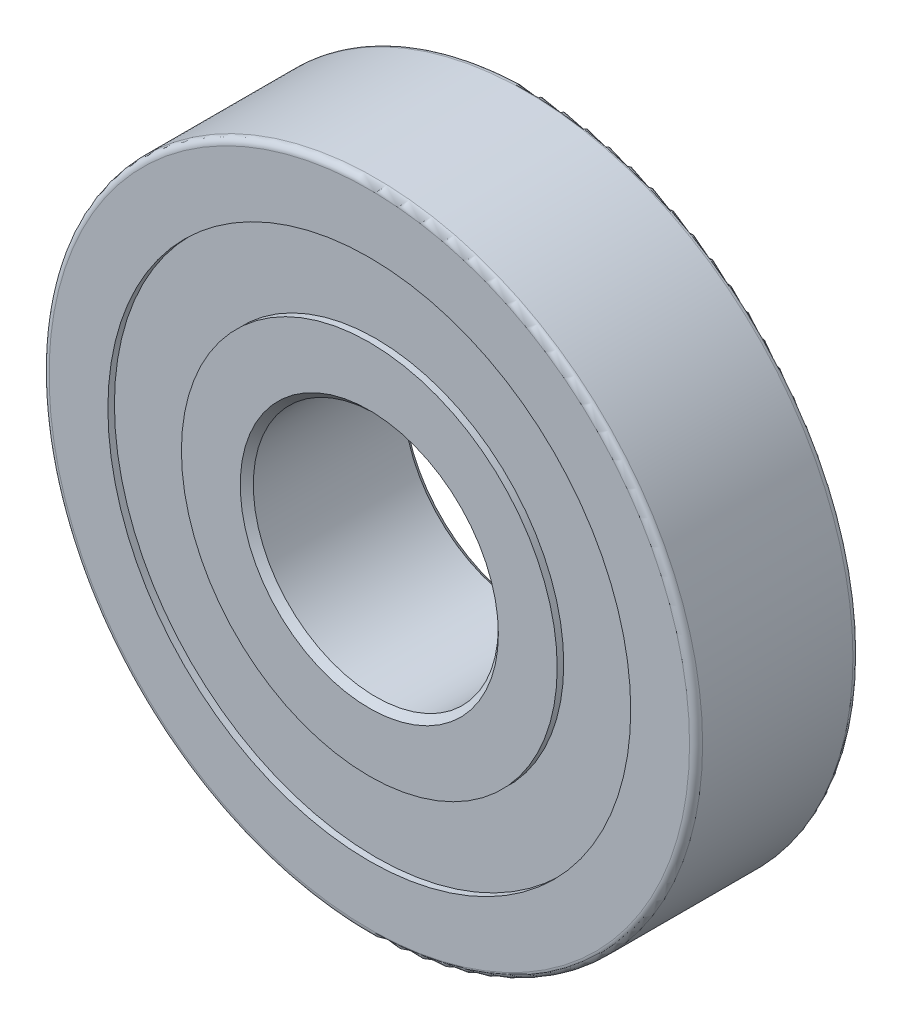
ISO-10303-21;
HEADER;
FILE_DESCRIPTION(('STEP AP214'),'2;1');
FILE_NAME('part.step','',(''),(''),'','','');
FILE_SCHEMA(('AUTOMOTIVE_DESIGN { 1 0 10303 214 1 1 1 1 }'));
ENDSEC;
DATA;
#1=APPLICATION_CONTEXT('core data for automotive mechanical design processes');
#2=APPLICATION_PROTOCOL_DEFINITION('international standard','automotive_design',2000,#1);
#3=PRODUCT_CONTEXT('',#1,'mechanical');
#4=PRODUCT('Part','Part','',(#3));
#5=PRODUCT_RELATED_PRODUCT_CATEGORY('part','',(#4));
#6=PRODUCT_DEFINITION_FORMATION('','',#4);
#7=PRODUCT_DEFINITION_CONTEXT('part definition',#1,'design');
#8=PRODUCT_DEFINITION('design','',#6,#7);
#9=PRODUCT_DEFINITION_SHAPE('','',#8);
#10=(LENGTH_UNIT() NAMED_UNIT(*) SI_UNIT(.MILLI.,.METRE.));
#11=(NAMED_UNIT(*) PLANE_ANGLE_UNIT() SI_UNIT($,.RADIAN.));
#12=(NAMED_UNIT(*) SI_UNIT($,.STERADIAN.) SOLID_ANGLE_UNIT());
#13=UNCERTAINTY_MEASURE_WITH_UNIT(LENGTH_MEASURE(1.E-05),#10,'distance_accuracy_value','');
#14=(GEOMETRIC_REPRESENTATION_CONTEXT(3) GLOBAL_UNCERTAINTY_ASSIGNED_CONTEXT((#13)) GLOBAL_UNIT_ASSIGNED_CONTEXT((#10,
#11,#12)) REPRESENTATION_CONTEXT('',''));
#15=CARTESIAN_POINT('',(0.,0.,0.));
#16=DIRECTION('',(0.,0.,1.));
#17=DIRECTION('',(1.,0.,0.));
#18=AXIS2_PLACEMENT_3D('',#15,#16,#17);
#19=CARTESIAN_POINT('',(0.,0.,1.5875));
#20=DIRECTION('',(0.,0.,-1.));
#21=DIRECTION('',(-1.,0.,0.));
#22=AXIS2_PLACEMENT_3D('',#19,#20,#21);
#23=CYLINDRICAL_SURFACE('',#22,5.08);
#24=CARTESIAN_POINT('',(0.,0.,-1.5875));
#25=DIRECTION('',(0.,0.,1.));
#26=DIRECTION('',(1.,0.,0.));
#27=AXIS2_PLACEMENT_3D('',#24,#25,#26);
#28=CIRCLE('',#27,5.08);
#29=CARTESIAN_POINT('',(5.08,0.,-1.5875));
#30=VERTEX_POINT('',#29);
#31=EDGE_CURVE('E81',#30,#30,#28,.T.);
#32=ORIENTED_EDGE('',*,*,#31,.F.);
#33=EDGE_LOOP('',(#32));
#34=FACE_BOUND('',#33,.T.);
#35=CARTESIAN_POINT('',(0.,0.,-1.4605));
#36=DIRECTION('',(0.,0.,1.));
#37=DIRECTION('',(1.,0.,0.));
#38=AXIS2_PLACEMENT_3D('',#35,#36,#37);
#39=CIRCLE('',#38,5.08);
#40=CARTESIAN_POINT('',(5.08,0.,-1.4605));
#41=VERTEX_POINT('',#40);
#42=EDGE_CURVE('E87',#41,#41,#39,.T.);
#43=ORIENTED_EDGE('',*,*,#42,.T.);
#44=EDGE_LOOP('',(#43));
#45=FACE_BOUND('',#44,.T.);
#46=ADVANCED_FACE('F44',(#34,#45),#23,.F.);
#47=CARTESIAN_POINT('',(0.,0.,1.4605));
#48=DIRECTION('',(0.,0.,1.));
#49=DIRECTION('',(1.,0.,0.));
#50=AXIS2_PLACEMENT_3D('',#47,#48,#49);
#51=CIRCLE('',#50,5.08);
#52=CARTESIAN_POINT('',(5.08,0.,1.4605));
#53=VERTEX_POINT('',#52);
#54=EDGE_CURVE('E77',#53,#53,#51,.T.);
#55=ORIENTED_EDGE('',*,*,#54,.F.);
#56=EDGE_LOOP('',(#55));
#57=FACE_BOUND('',#56,.T.);
#58=CARTESIAN_POINT('',(0.,0.,1.5875));
#59=DIRECTION('',(0.,0.,1.));
#60=DIRECTION('',(1.,0.,0.));
#61=AXIS2_PLACEMENT_3D('',#58,#59,#60);
#62=CIRCLE('',#61,5.08);
#63=CARTESIAN_POINT('',(5.08,0.,1.5875));
#64=VERTEX_POINT('',#63);
#65=EDGE_CURVE('E80',#64,#64,#62,.T.);
#66=ORIENTED_EDGE('',*,*,#65,.T.);
#67=EDGE_LOOP('',(#66));
#68=FACE_BOUND('',#67,.T.);
#69=ADVANCED_FACE('F122',(#57,#68),#23,.F.);
#70=CARTESIAN_POINT('',(0.,0.,1.5875));
#71=DIRECTION('',(0.,0.,-1.));
#72=DIRECTION('',(-1.,0.,0.));
#73=AXIS2_PLACEMENT_3D('',#70,#71,#72);
#74=CYLINDRICAL_SURFACE('',#73,6.35);
#75=CARTESIAN_POINT('',(0.,0.,-1.4605));
#76=DIRECTION('',(0.,0.,1.));
#77=DIRECTION('',(1.,0.,0.));
#78=AXIS2_PLACEMENT_3D('',#75,#76,#77);
#79=CIRCLE('',#78,6.35);
#80=CARTESIAN_POINT('',(6.35,0.,-1.4605));
#81=VERTEX_POINT('',#80);
#82=EDGE_CURVE('E71',#81,#81,#79,.T.);
#83=ORIENTED_EDGE('',*,*,#82,.T.);
#84=EDGE_LOOP('',(#83));
#85=FACE_BOUND('',#84,.T.);
#86=CARTESIAN_POINT('',(0.,0.,1.4605));
#87=DIRECTION('',(0.,0.,1.));
#88=DIRECTION('',(1.,0.,0.));
#89=AXIS2_PLACEMENT_3D('',#86,#87,#88);
#90=CIRCLE('',#89,6.35);
#91=CARTESIAN_POINT('',(6.35,0.,1.4605));
#92=VERTEX_POINT('',#91);
#93=EDGE_CURVE('E74',#92,#92,#90,.F.);
#94=ORIENTED_EDGE('',*,*,#93,.T.);
#95=EDGE_LOOP('',(#94));
#96=FACE_BOUND('',#95,.T.);
#97=ADVANCED_FACE('F128',(#85,#96),#74,.T.);
#98=CARTESIAN_POINT('',(0.,0.,1.5875));
#99=DIRECTION('',(0.,0.,1.));
#100=DIRECTION('',(1.,0.,0.));
#101=AXIS2_PLACEMENT_3D('',#98,#99,#100);
#102=PLANE('',#101);
#103=CARTESIAN_POINT('',(0.,0.,1.5875));
#104=DIRECTION('',(0.,0.,1.));
#105=DIRECTION('',(1.,0.,0.));
#106=AXIS2_PLACEMENT_3D('',#103,#104,#105);
#107=CIRCLE('',#106,6.223);
#108=CARTESIAN_POINT('',(6.223,0.,1.5875));
#109=VERTEX_POINT('',#108);
#110=EDGE_CURVE('E65',#109,#109,#107,.T.);
#111=ORIENTED_EDGE('',*,*,#110,.T.);
#112=EDGE_LOOP('',(#111));
#113=FACE_BOUND('',#112,.T.);
#114=ORIENTED_EDGE('',*,*,#65,.F.);
#115=EDGE_LOOP('',(#114));
#116=FACE_BOUND('',#115,.T.);
#117=ADVANCED_FACE('F174',(#113,#116),#102,.T.);
#118=CARTESIAN_POINT('',(0.,0.,-1.5875));
#119=DIRECTION('',(0.,0.,1.));
#120=DIRECTION('',(1.,0.,0.));
#121=AXIS2_PLACEMENT_3D('',#118,#119,#120);
#122=PLANE('',#121);
#123=CARTESIAN_POINT('',(0.,0.,-1.5875));
#124=DIRECTION('',(0.,0.,1.));
#125=DIRECTION('',(1.,0.,0.));
#126=AXIS2_PLACEMENT_3D('',#123,#124,#125);
#127=CIRCLE('',#126,6.223);
#128=CARTESIAN_POINT('',(6.223,0.,-1.5875));
#129=VERTEX_POINT('',#128);
#130=EDGE_CURVE('E68',#129,#129,#127,.F.);
#131=ORIENTED_EDGE('',*,*,#130,.T.);
#132=EDGE_LOOP('',(#131));
#133=FACE_BOUND('',#132,.T.);
#134=ORIENTED_EDGE('',*,*,#31,.T.);
#135=EDGE_LOOP('',(#134));
#136=FACE_BOUND('',#135,.T.);
#137=ADVANCED_FACE('F170',(#133,#136),#122,.F.);
#138=CARTESIAN_POINT('',(0.,0.,1.4605));
#139=DIRECTION('',(0.,0.,1.));
#140=DIRECTION('',(1.,0.,0.));
#141=AXIS2_PLACEMENT_3D('',#138,#139,#140);
#142=PLANE('',#141);
#143=CARTESIAN_POINT('',(0.,0.,1.4605));
#144=DIRECTION('',(0.,0.,1.));
#145=DIRECTION('',(1.,0.,0.));
#146=AXIS2_PLACEMENT_3D('',#143,#144,#145);
#147=CIRCLE('',#146,3.65125);
#148=CARTESIAN_POINT('',(3.65125,0.,1.4605));
#149=VERTEX_POINT('',#148);
#150=EDGE_CURVE('E84',#149,#149,#147,.T.);
#151=ORIENTED_EDGE('',*,*,#150,.F.);
#152=EDGE_LOOP('',(#151));
#153=FACE_BOUND('',#152,.T.);
#154=ORIENTED_EDGE('',*,*,#54,.T.);
#155=EDGE_LOOP('',(#154));
#156=FACE_BOUND('',#155,.T.);
#157=ADVANCED_FACE('F163',(#153,#156),#142,.T.);
#158=CARTESIAN_POINT('',(0.,0.,-1.4605));
#159=DIRECTION('',(0.,0.,1.));
#160=DIRECTION('',(1.,0.,0.));
#161=AXIS2_PLACEMENT_3D('',#158,#159,#160);
#162=PLANE('',#161);
#163=CARTESIAN_POINT('',(0.,0.,-1.4605));
#164=DIRECTION('',(0.,0.,1.));
#165=DIRECTION('',(1.,0.,0.));
#166=AXIS2_PLACEMENT_3D('',#163,#164,#165);
#167=CIRCLE('',#166,3.65125);
#168=CARTESIAN_POINT('',(3.65125,0.,-1.4605));
#169=VERTEX_POINT('',#168);
#170=EDGE_CURVE('E90',#169,#169,#167,.F.);
#171=ORIENTED_EDGE('',*,*,#170,.F.);
#172=EDGE_LOOP('',(#171));
#173=FACE_BOUND('',#172,.T.);
#174=ORIENTED_EDGE('',*,*,#42,.F.);
#175=EDGE_LOOP('',(#174));
#176=FACE_BOUND('',#175,.T.);
#177=ADVANCED_FACE('F119',(#173,#176),#162,.F.);
#178=CARTESIAN_POINT('',(0.,0.,1.5875));
#179=DIRECTION('',(0.,0.,-1.));
#180=DIRECTION('',(-1.,0.,0.));
#181=AXIS2_PLACEMENT_3D('',#178,#179,#180);
#182=CYLINDRICAL_SURFACE('',#181,3.65125);
#183=CARTESIAN_POINT('',(0.,0.,-1.5875));
#184=DIRECTION('',(0.,0.,1.));
#185=DIRECTION('',(1.,0.,0.));
#186=AXIS2_PLACEMENT_3D('',#183,#184,#185);
#187=CIRCLE('',#186,3.65125);
#188=CARTESIAN_POINT('',(3.65125,0.,-1.5875));
#189=VERTEX_POINT('',#188);
#190=EDGE_CURVE('E96',#189,#189,#187,.T.);
#191=ORIENTED_EDGE('',*,*,#190,.T.);
#192=EDGE_LOOP('',(#191));
#193=FACE_BOUND('',#192,.T.);
#194=ORIENTED_EDGE('',*,*,#170,.T.);
#195=EDGE_LOOP('',(#194));
#196=FACE_BOUND('',#195,.T.);
#197=ADVANCED_FACE('F109',(#193,#196),#182,.T.);
#198=CARTESIAN_POINT('',(0.,0.,1.5875));
#199=DIRECTION('',(0.,0.,-1.));
#200=DIRECTION('',(-1.,0.,0.));
#201=AXIS2_PLACEMENT_3D('',#198,#199,#200);
#202=CYLINDRICAL_SURFACE('',#201,2.38125);
#203=CARTESIAN_POINT('',(0.,0.,-1.4605));
#204=DIRECTION('',(0.,0.,1.));
#205=DIRECTION('',(1.,0.,0.));
#206=AXIS2_PLACEMENT_3D('',#203,#204,#205);
#207=CIRCLE('',#206,2.38125);
#208=CARTESIAN_POINT('',(2.38125,0.,-1.4605));
#209=VERTEX_POINT('',#208);
#210=EDGE_CURVE('E52',#209,#209,#207,.F.);
#211=ORIENTED_EDGE('',*,*,#210,.T.);
#212=EDGE_LOOP('',(#211));
#213=FACE_BOUND('',#212,.T.);
#214=CARTESIAN_POINT('',(0.,0.,1.4605));
#215=DIRECTION('',(0.,0.,1.));
#216=DIRECTION('',(1.,0.,0.));
#217=AXIS2_PLACEMENT_3D('',#214,#215,#216);
#218=CIRCLE('',#217,2.38125);
#219=CARTESIAN_POINT('',(2.38125,0.,1.4605));
#220=VERTEX_POINT('',#219);
#221=EDGE_CURVE('E56',#220,#220,#218,.T.);
#222=ORIENTED_EDGE('',*,*,#221,.T.);
#223=EDGE_LOOP('',(#222));
#224=FACE_BOUND('',#223,.T.);
#225=ADVANCED_FACE('F106',(#213,#224),#202,.F.);
#226=ORIENTED_EDGE('',*,*,#150,.T.);
#227=EDGE_LOOP('',(#226));
#228=FACE_BOUND('',#227,.T.);
#229=CARTESIAN_POINT('',(0.,0.,1.5875));
#230=DIRECTION('',(0.,0.,1.));
#231=DIRECTION('',(1.,0.,0.));
#232=AXIS2_PLACEMENT_3D('',#229,#230,#231);
#233=CIRCLE('',#232,3.65125);
#234=CARTESIAN_POINT('',(3.65125,0.,1.5875));
#235=VERTEX_POINT('',#234);
#236=EDGE_CURVE('E95',#235,#235,#233,.T.);
#237=ORIENTED_EDGE('',*,*,#236,.F.);
#238=EDGE_LOOP('',(#237));
#239=FACE_BOUND('',#238,.T.);
#240=ADVANCED_FACE('F104',(#228,#239),#182,.T.);
#241=CARTESIAN_POINT('',(0.,0.,1.5875));
#242=DIRECTION('',(0.,0.,1.));
#243=DIRECTION('',(1.,0.,0.));
#244=AXIS2_PLACEMENT_3D('',#241,#242,#243);
#245=PLANE('',#244);
#246=CARTESIAN_POINT('',(0.,0.,1.5875));
#247=DIRECTION('',(0.,0.,1.));
#248=DIRECTION('',(1.,0.,0.));
#249=AXIS2_PLACEMENT_3D('',#246,#247,#248);
#250=CIRCLE('',#249,2.50825);
#251=CARTESIAN_POINT('',(2.50825,0.,1.5875));
#252=VERTEX_POINT('',#251);
#253=EDGE_CURVE('E11',#252,#252,#250,.F.);
#254=ORIENTED_EDGE('',*,*,#253,.T.);
#255=EDGE_LOOP('',(#254));
#256=FACE_BOUND('',#255,.T.);
#257=ORIENTED_EDGE('',*,*,#236,.T.);
#258=EDGE_LOOP('',(#257));
#259=FACE_BOUND('',#258,.T.);
#260=ADVANCED_FACE('F102',(#256,#259),#245,.T.);
#261=CARTESIAN_POINT('',(0.,0.,-1.5875));
#262=DIRECTION('',(0.,0.,1.));
#263=DIRECTION('',(1.,0.,0.));
#264=AXIS2_PLACEMENT_3D('',#261,#262,#263);
#265=PLANE('',#264);
#266=CARTESIAN_POINT('',(0.,0.,-1.5875));
#267=DIRECTION('',(0.,0.,1.));
#268=DIRECTION('',(1.,0.,0.));
#269=AXIS2_PLACEMENT_3D('',#266,#267,#268);
#270=CIRCLE('',#269,2.50825);
#271=CARTESIAN_POINT('',(2.50825,0.,-1.5875));
#272=VERTEX_POINT('',#271);
#273=EDGE_CURVE('E60',#272,#272,#270,.T.);
#274=ORIENTED_EDGE('',*,*,#273,.T.);
#275=EDGE_LOOP('',(#274));
#276=FACE_BOUND('',#275,.T.);
#277=ORIENTED_EDGE('',*,*,#190,.F.);
#278=EDGE_LOOP('',(#277));
#279=FACE_BOUND('',#278,.T.);
#280=ADVANCED_FACE('F114',(#276,#279),#265,.F.);
#281=CARTESIAN_POINT('',(0.,0.,-1.4605));
#282=DIRECTION('',(0.,0.,1.));
#283=DIRECTION('',(1.,0.,0.));
#284=AXIS2_PLACEMENT_3D('',#281,#282,#283);
#285=TOROIDAL_SURFACE('',#284,6.223,0.127);
#286=ORIENTED_EDGE('',*,*,#130,.F.);
#287=EDGE_LOOP('',(#286));
#288=FACE_BOUND('',#287,.T.);
#289=ORIENTED_EDGE('',*,*,#82,.F.);
#290=EDGE_LOOP('',(#289));
#291=FACE_BOUND('',#290,.T.);
#292=ADVANCED_FACE('F135',(#288,#291),#285,.T.);
#293=CARTESIAN_POINT('',(0.,0.,1.4605));
#294=DIRECTION('',(0.,0.,1.));
#295=DIRECTION('',(1.,0.,0.));
#296=AXIS2_PLACEMENT_3D('',#293,#294,#295);
#297=TOROIDAL_SURFACE('',#296,6.223,0.127);
#298=ORIENTED_EDGE('',*,*,#93,.F.);
#299=EDGE_LOOP('',(#298));
#300=FACE_BOUND('',#299,.T.);
#301=ORIENTED_EDGE('',*,*,#110,.F.);
#302=EDGE_LOOP('',(#301));
#303=FACE_BOUND('',#302,.T.);
#304=ADVANCED_FACE('F138',(#300,#303),#297,.T.);
#305=CARTESIAN_POINT('',(0.,0.,-1.5875));
#306=DIRECTION('',(0.,0.,-1.));
#307=DIRECTION('',(-1.,0.,0.));
#308=AXIS2_PLACEMENT_3D('',#305,#306,#307);
#309=CONICAL_SURFACE('',#308,2.50825,0.785398163397447);
#310=ORIENTED_EDGE('',*,*,#210,.F.);
#311=EDGE_LOOP('',(#310));
#312=FACE_BOUND('',#311,.T.);
#313=ORIENTED_EDGE('',*,*,#273,.F.);
#314=EDGE_LOOP('',(#313));
#315=FACE_BOUND('',#314,.T.);
#316=ADVANCED_FACE('F141',(#312,#315),#309,.F.);
#317=CARTESIAN_POINT('',(0.,0.,1.4605));
#318=DIRECTION('',(0.,0.,1.));
#319=DIRECTION('',(1.,0.,0.));
#320=AXIS2_PLACEMENT_3D('',#317,#318,#319);
#321=CONICAL_SURFACE('',#320,2.38125,0.78539816339745);
#322=ORIENTED_EDGE('',*,*,#253,.F.);
#323=EDGE_LOOP('',(#322));
#324=FACE_BOUND('',#323,.T.);
#325=ORIENTED_EDGE('',*,*,#221,.F.);
#326=EDGE_LOOP('',(#325));
#327=FACE_BOUND('',#326,.T.);
#328=ADVANCED_FACE('F47',(#324,#327),#321,.F.);
#329=CLOSED_SHELL('',(#46,#69,#97,#117,#137,#157,#177,#197,#225,#240,#260,#280,#292,#304,#316,#328));
#330=MANIFOLD_SOLID_BREP('B2',#329);
#331=ADVANCED_BREP_SHAPE_REPRESENTATION('',(#18,#330),#14);
#332=SHAPE_DEFINITION_REPRESENTATION(#9,#331);
ENDSEC;
END-ISO-10303-21;
